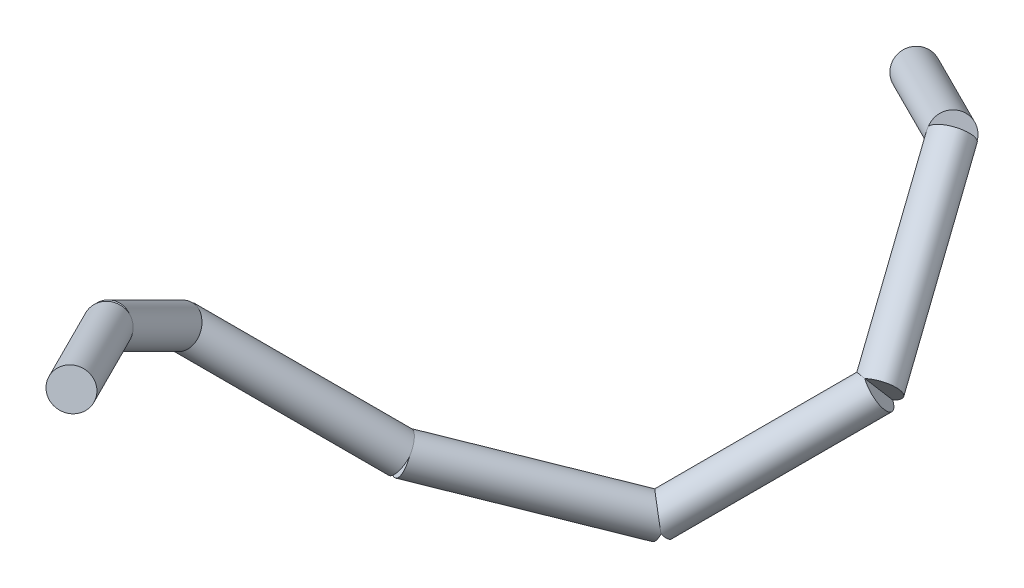
ISO-10303-21;
HEADER;
FILE_DESCRIPTION(('STEP AP214'),'2;1');
FILE_NAME('part.step','',(''),(''),'','','');
FILE_SCHEMA(('AUTOMOTIVE_DESIGN { 1 0 10303 214 1 1 1 1 }'));
ENDSEC;
DATA;
#1=APPLICATION_CONTEXT('core data for automotive mechanical design processes');
#2=APPLICATION_PROTOCOL_DEFINITION('international standard','automotive_design',2000,#1);
#3=PRODUCT_CONTEXT('',#1,'mechanical');
#4=PRODUCT('Part','Part','',(#3));
#5=PRODUCT_RELATED_PRODUCT_CATEGORY('part','',(#4));
#6=PRODUCT_DEFINITION_FORMATION('','',#4);
#7=PRODUCT_DEFINITION_CONTEXT('part definition',#1,'design');
#8=PRODUCT_DEFINITION('design','',#6,#7);
#9=PRODUCT_DEFINITION_SHAPE('','',#8);
#10=(LENGTH_UNIT() NAMED_UNIT(*) SI_UNIT(.MILLI.,.METRE.));
#11=(NAMED_UNIT(*) PLANE_ANGLE_UNIT() SI_UNIT($,.RADIAN.));
#12=(NAMED_UNIT(*) SI_UNIT($,.STERADIAN.) SOLID_ANGLE_UNIT());
#13=UNCERTAINTY_MEASURE_WITH_UNIT(LENGTH_MEASURE(1.E-05),#10,'distance_accuracy_value','');
#14=(GEOMETRIC_REPRESENTATION_CONTEXT(3) GLOBAL_UNCERTAINTY_ASSIGNED_CONTEXT((#13)) GLOBAL_UNIT_ASSIGNED_CONTEXT((#10,
#11,#12)) REPRESENTATION_CONTEXT('',''));
#15=CARTESIAN_POINT('',(0.,0.,0.));
#16=DIRECTION('',(0.,0.,1.));
#17=DIRECTION('',(1.,0.,0.));
#18=AXIS2_PLACEMENT_3D('',#15,#16,#17);
#19=CARTESIAN_POINT('',(0.,0.,0.));
#20=DIRECTION('',(0.742781352708207,0.371390676354103,0.557086014531156));
#21=DIRECTION('',(0.,-0.832050294337844,0.554700196225229));
#22=AXIS2_PLACEMENT_3D('',#19,#20,#21);
#23=PLANE('',#22);
#24=CARTESIAN_POINT('',(0.,0.,0.));
#25=DIRECTION('',(0.742781352708208,0.371390676354104,0.557086014531156));
#26=DIRECTION('',(0.645668811625015,-0.177165594188004,-0.742781352708018));
#27=AXIS2_PLACEMENT_3D('',#24,#25,#26);
#28=CIRCLE('',#27,10.);
#29=CARTESIAN_POINT('',(6.456688116249,-1.771655941875,-7.427813527082));
#30=VERTEX_POINT('',#29);
#31=EDGE_CURVE('E11',#30,#30,#28,.T.);
#32=ORIENTED_EDGE('',*,*,#31,.F.);
#33=EDGE_LOOP('',(#32));
#34=FACE_BOUND('',#33,.T.);
#35=ADVANCED_FACE('F17',(#34),#23,.F.);
#36=CARTESIAN_POINT('',(80.,40.,60.));
#37=DIRECTION('',(0.742781352708207,0.371390676354103,0.557086014531156));
#38=DIRECTION('',(0.,-0.832050294337844,0.554700196225229));
#39=AXIS2_PLACEMENT_3D('',#36,#37,#38);
#40=PLANE('',#39);
#41=CARTESIAN_POINT('',(80.,40.,60.));
#42=DIRECTION('',(0.742781352708208,0.371390676354104,0.557086014531156));
#43=DIRECTION('',(0.645668811625015,-0.177165594188004,-0.742781352708018));
#44=AXIS2_PLACEMENT_3D('',#41,#42,#43);
#45=CIRCLE('',#44,10.);
#46=CARTESIAN_POINT('',(86.693743463144,36.062503845209,53.700006152335));
#47=VERTEX_POINT('',#46);
#48=CARTESIAN_POINT('',(86.456688116249,38.228344058125,52.572186472918));
#49=VERTEX_POINT('',#48);
#50=EDGE_CURVE('E306',#47,#49,#45,.T.);
#51=ORIENTED_EDGE('',*,*,#50,.T.);
#52=CARTESIAN_POINT('',(80.,40.,60.));
#53=DIRECTION('',(0.742781352708208,0.371390676354104,0.557086014531156));
#54=DIRECTION('',(0.645668811625015,-0.177165594188004,-0.742781352708018));
#55=AXIS2_PLACEMENT_3D('',#52,#53,#54);
#56=CIRCLE('',#55,10.);
#57=CARTESIAN_POINT('',(73.306256536856,43.937496154791,66.299993847665));
#58=VERTEX_POINT('',#57);
#59=EDGE_CURVE('E26',#49,#58,#56,.T.);
#60=ORIENTED_EDGE('',*,*,#59,.T.);
#61=DIRECTION('',(0.669374346314016,-0.393749615479009,-0.629999384767015));
#62=VECTOR('',#61,1.);
#63=CARTESIAN_POINT('',(80.,40.,60.));
#64=LINE('',#63,#62);
#65=EDGE_CURVE('E299',#58,#47,#64,.T.);
#66=ORIENTED_EDGE('',*,*,#65,.T.);
#67=EDGE_LOOP('',(#51,#60,#66));
#68=FACE_BOUND('',#67,.T.);
#69=ADVANCED_FACE('F19',(#68),#40,.T.);
#70=CARTESIAN_POINT('',(0.,0.,0.));
#71=DIRECTION('',(0.742781352708208,0.371390676354104,0.557086014531156));
#72=DIRECTION('',(0.645668811625015,-0.177165594188004,-0.742781352708018));
#73=AXIS2_PLACEMENT_3D('',#70,#71,#72);
#74=CYLINDRICAL_SURFACE('',#73,10.);
#75=DIRECTION('',(0.742781352708207,0.371390676354103,0.557086014531156));
#76=VECTOR('',#75,1.);
#77=CARTESIAN_POINT('',(6.456688116249,-1.771655941875,-7.427813527082));
#78=LINE('',#77,#76);
#79=EDGE_CURVE('E303',#30,#49,#78,.T.);
#80=ORIENTED_EDGE('',*,*,#79,.T.);
#81=ORIENTED_EDGE('',*,*,#50,.F.);
#82=CARTESIAN_POINT('',(80.,40.,60.));
#83=DIRECTION('',(0.64699663922071,-0.107832773203485,0.754829412423995));
#84=DIRECTION('',(0.365148371670111,0.912870929175277,-0.182574185835055));
#85=AXIS2_PLACEMENT_3D('',#82,#83,#84);
#86=ELLIPSE('',#85,11.613945106217,10.);
#87=EDGE_CURVE('E203',#58,#47,#86,.T.);
#88=ORIENTED_EDGE('',*,*,#87,.F.);
#89=ORIENTED_EDGE('',*,*,#59,.F.);
#90=ORIENTED_EDGE('',*,*,#79,.F.);
#91=ORIENTED_EDGE('',*,*,#31,.T.);
#92=EDGE_LOOP('',(#80,#81,#88,#89,#90,#91));
#93=FACE_BOUND('',#92,.T.);
#94=ADVANCED_FACE('F317',(#93),#74,.T.);
#95=CARTESIAN_POINT('',(80.,40.,60.));
#96=DIRECTION('',(0.371390676354103,-0.557086014531156,0.742781352708207));
#97=DIRECTION('',(-0.832050294337844,-0.554700196225229,0.));
#98=AXIS2_PLACEMENT_3D('',#95,#96,#97);
#99=PLANE('',#98);
#100=ORIENTED_EDGE('',*,*,#65,.F.);
#101=CARTESIAN_POINT('',(80.,40.,60.));
#102=DIRECTION('',(0.371390676354104,-0.557086014531156,0.742781352708208));
#103=DIRECTION('',(0.920855800833292,0.118716298750038,-0.371390676354117));
#104=AXIS2_PLACEMENT_3D('',#101,#102,#103);
#105=CIRCLE('',#104,10.);
#106=CARTESIAN_POINT('',(89.208558008333,41.187162987501,56.286093236459));
#107=VERTEX_POINT('',#106);
#108=EDGE_CURVE('E199',#107,#58,#105,.T.);
#109=ORIENTED_EDGE('',*,*,#108,.F.);
#110=CARTESIAN_POINT('',(80.,40.,60.));
#111=DIRECTION('',(0.371390676354104,-0.557086014531156,0.742781352708208));
#112=DIRECTION('',(0.920855800833292,0.118716298750038,-0.371390676354117));
#113=AXIS2_PLACEMENT_3D('',#110,#111,#112);
#114=CIRCLE('',#113,10.);
#115=EDGE_CURVE('E296',#47,#107,#114,.T.);
#116=ORIENTED_EDGE('',*,*,#115,.F.);
#117=EDGE_LOOP('',(#100,#109,#116));
#118=FACE_BOUND('',#117,.T.);
#119=ADVANCED_FACE('F315',(#118),#99,.F.);
#120=CARTESIAN_POINT('',(120.,-20.,140.));
#121=DIRECTION('',(0.371390676354103,-0.557086014531156,0.742781352708207));
#122=DIRECTION('',(-0.832050294337844,-0.554700196225229,0.));
#123=AXIS2_PLACEMENT_3D('',#120,#121,#122);
#124=PLANE('',#123);
#125=CARTESIAN_POINT('',(120.,-20.,140.));
#126=DIRECTION('',(0.371390676354104,-0.557086014531156,0.742781352708208));
#127=DIRECTION('',(0.920855800833292,0.118716298750038,-0.371390676354117));
#128=AXIS2_PLACEMENT_3D('',#125,#126,#127);
#129=CIRCLE('',#128,10.);
#130=CARTESIAN_POINT('',(121.27000127,-27.62000762001,133.64999364999));
#131=VERTEX_POINT('',#130);
#132=CARTESIAN_POINT('',(129.20855800833,-18.81283701249,136.28609323645));
#133=VERTEX_POINT('',#132);
#134=EDGE_CURVE('E178',#131,#133,#129,.T.);
#135=ORIENTED_EDGE('',*,*,#134,.T.);
#136=CARTESIAN_POINT('',(120.,-20.,140.));
#137=DIRECTION('',(0.371390676354104,-0.557086014531156,0.742781352708208));
#138=DIRECTION('',(0.920855800833292,0.118716298750038,-0.371390676354117));
#139=AXIS2_PLACEMENT_3D('',#136,#137,#138);
#140=CIRCLE('',#139,10.);
#141=CARTESIAN_POINT('',(118.72999872999,-12.37999237998,146.35000635001));
#142=VERTEX_POINT('',#141);
#143=EDGE_CURVE('E272',#133,#142,#140,.T.);
#144=ORIENTED_EDGE('',*,*,#143,.T.);
#145=DIRECTION('',(0.127000127000013,-0.762000762001079,-0.635000635001065));
#146=VECTOR('',#145,1.);
#147=CARTESIAN_POINT('',(120.,-20.,140.));
#148=LINE('',#147,#146);
#149=EDGE_CURVE('E287',#142,#131,#148,.T.);
#150=ORIENTED_EDGE('',*,*,#149,.T.);
#151=EDGE_LOOP('',(#135,#144,#150));
#152=FACE_BOUND('',#151,.T.);
#153=ADVANCED_FACE('F325',(#152),#124,.T.);
#154=CARTESIAN_POINT('',(80.,40.,60.));
#155=DIRECTION('',(0.371390676354104,-0.557086014531156,0.742781352708208));
#156=DIRECTION('',(0.920855800833292,0.118716298750038,-0.371390676354117));
#157=AXIS2_PLACEMENT_3D('',#154,#155,#156);
#158=CYLINDRICAL_SURFACE('',#157,10.);
#159=ORIENTED_EDGE('',*,*,#143,.F.);
#160=DIRECTION('',(0.371390676354103,-0.557086014531156,0.742781352708207));
#161=VECTOR('',#160,1.);
#162=CARTESIAN_POINT('',(89.208558008333,41.187162987501,56.286093236459));
#163=LINE('',#162,#161);
#164=EDGE_CURVE('E204',#107,#133,#163,.T.);
#165=ORIENTED_EDGE('',*,*,#164,.F.);
#166=ORIENTED_EDGE('',*,*,#108,.T.);
#167=ORIENTED_EDGE('',*,*,#87,.T.);
#168=ORIENTED_EDGE('',*,*,#115,.T.);
#169=ORIENTED_EDGE('',*,*,#164,.T.);
#170=ORIENTED_EDGE('',*,*,#134,.F.);
#171=CARTESIAN_POINT('',(120.,-20.,140.));
#172=DIRECTION('',(-0.117506925789919,-0.647234335479943,0.753179817418948));
#173=DIRECTION('',(0.984917808821325,0.021036959972447,0.171739209797057));
#174=AXIS2_PLACEMENT_3D('',#171,#172,#173);
#175=ELLIPSE('',#174,11.410677616157,10.);
#176=EDGE_CURVE('E214',#142,#131,#175,.T.);
#177=ORIENTED_EDGE('',*,*,#176,.F.);
#178=EDGE_LOOP('',(#159,#165,#166,#167,#168,#169,#170,#177));
#179=FACE_BOUND('',#178,.T.);
#180=ADVANCED_FACE('F320',(#179),#158,.T.);
#181=CARTESIAN_POINT('',(120.,-20.,140.));
#182=DIRECTION('',(-0.577350269189626,-0.577350269189626,0.577350269189626));
#183=DIRECTION('',(-0.707106781186548,0.707106781186548,0.));
#184=AXIS2_PLACEMENT_3D('',#181,#182,#183);
#185=PLANE('',#184);
#186=ORIENTED_EDGE('',*,*,#149,.F.);
#187=CARTESIAN_POINT('',(120.,-20.,140.));
#188=DIRECTION('',(-0.577350269189626,-0.577350269189626,0.577350269189626));
#189=DIRECTION('',(0.788675134594744,-0.211324865404932,0.577350269189813));
#190=AXIS2_PLACEMENT_3D('',#187,#188,#189);
#191=CIRCLE('',#190,10.);
#192=CARTESIAN_POINT('',(127.88675134594,-22.11324865405,145.77350269189));
#193=VERTEX_POINT('',#192);
#194=EDGE_CURVE('E219',#193,#142,#191,.T.);
#195=ORIENTED_EDGE('',*,*,#194,.F.);
#196=CARTESIAN_POINT('',(120.,-20.,140.));
#197=DIRECTION('',(-0.577350269189626,-0.577350269189626,0.577350269189626));
#198=DIRECTION('',(0.788675134594744,-0.211324865404932,0.577350269189813));
#199=AXIS2_PLACEMENT_3D('',#196,#197,#198);
#200=CIRCLE('',#199,10.);
#201=EDGE_CURVE('E218',#131,#193,#200,.T.);
#202=ORIENTED_EDGE('',*,*,#201,.F.);
#203=EDGE_LOOP('',(#186,#195,#202));
#204=FACE_BOUND('',#203,.T.);
#205=ADVANCED_FACE('F328',(#204),#185,.F.);
#206=CARTESIAN_POINT('',(60.,-80.,200.));
#207=DIRECTION('',(-0.577350269189626,-0.577350269189626,0.577350269189626));
#208=DIRECTION('',(-0.707106781186548,0.707106781186548,0.));
#209=AXIS2_PLACEMENT_3D('',#206,#207,#208);
#210=PLANE('',#209);
#211=CARTESIAN_POINT('',(60.,-80.,200.));
#212=DIRECTION('',(-0.577350269189626,-0.577350269189626,0.577350269189626));
#213=DIRECTION('',(0.788675134594744,-0.211324865404932,0.577350269189813));
#214=AXIS2_PLACEMENT_3D('',#211,#212,#213);
#215=CIRCLE('',#214,10.);
#216=CARTESIAN_POINT('',(52.379992379989,-78.72999872999,193.64999364999));
#217=VERTEX_POINT('',#216);
#218=CARTESIAN_POINT('',(67.886751345948,-82.11324865405,205.77350269189));
#219=VERTEX_POINT('',#218);
#220=EDGE_CURVE('E281',#217,#219,#215,.T.);
#221=ORIENTED_EDGE('',*,*,#220,.T.);
#222=CARTESIAN_POINT('',(60.,-80.,200.));
#223=DIRECTION('',(-0.577350269189626,-0.577350269189626,0.577350269189626));
#224=DIRECTION('',(0.788675134594744,-0.211324865404932,0.577350269189813));
#225=AXIS2_PLACEMENT_3D('',#222,#223,#224);
#226=CIRCLE('',#225,10.);
#227=CARTESIAN_POINT('',(67.620007620011,-81.27000127,206.35000635001));
#228=VERTEX_POINT('',#227);
#229=EDGE_CURVE('E237',#219,#228,#226,.T.);
#230=ORIENTED_EDGE('',*,*,#229,.T.);
#231=DIRECTION('',(-0.762000762001079,0.127000127000013,-0.635000635001065));
#232=VECTOR('',#231,1.);
#233=CARTESIAN_POINT('',(60.,-80.,200.));
#234=LINE('',#233,#232);
#235=EDGE_CURVE('E284',#228,#217,#234,.T.);
#236=ORIENTED_EDGE('',*,*,#235,.T.);
#237=EDGE_LOOP('',(#221,#230,#236));
#238=FACE_BOUND('',#237,.T.);
#239=ADVANCED_FACE('F393',(#238),#210,.T.);
#240=CARTESIAN_POINT('',(60.,-80.,200.));
#241=DIRECTION('',(-0.557086014531156,0.371390676354103,0.742781352708207));
#242=DIRECTION('',(0.554700196225229,0.832050294337844,0.));
#243=AXIS2_PLACEMENT_3D('',#240,#241,#242);
#244=PLANE('',#243);
#245=CARTESIAN_POINT('',(60.,-80.,200.));
#246=DIRECTION('',(-0.557086014531003,0.371390676354126,0.742781352708311));
#247=DIRECTION('',(0.821925551875018,0.118716298750003,0.557086014531012));
#248=AXIS2_PLACEMENT_3D('',#245,#246,#247);
#249=CIRCLE('',#248,10.);
#250=EDGE_CURVE('E211',#217,#228,#249,.T.);
#251=ORIENTED_EDGE('',*,*,#250,.F.);
#252=ORIENTED_EDGE('',*,*,#235,.F.);
#253=EDGE_LOOP('',(#251,#252));
#254=FACE_BOUND('',#253,.T.);
#255=ADVANCED_FACE('F339',(#254),#244,.F.);
#256=CARTESIAN_POINT('',(120.,-20.,140.));
#257=DIRECTION('',(-0.577350269189626,-0.577350269189626,0.577350269189626));
#258=DIRECTION('',(0.788675134594745,-0.211324865404932,0.577350269189813));
#259=AXIS2_PLACEMENT_3D('',#256,#257,#258);
#260=CYLINDRICAL_SURFACE('',#259,10.);
#261=ORIENTED_EDGE('',*,*,#229,.F.);
#262=DIRECTION('',(-0.577350269189626,-0.577350269189626,0.577350269189626));
#263=VECTOR('',#262,1.);
#264=CARTESIAN_POINT('',(127.88675134594,-22.11324865405,145.77350269189));
#265=LINE('',#264,#263);
#266=EDGE_CURVE('E233',#193,#219,#265,.T.);
#267=ORIENTED_EDGE('',*,*,#266,.F.);
#268=ORIENTED_EDGE('',*,*,#194,.T.);
#269=ORIENTED_EDGE('',*,*,#176,.T.);
#270=ORIENTED_EDGE('',*,*,#201,.T.);
#271=ORIENTED_EDGE('',*,*,#266,.T.);
#272=ORIENTED_EDGE('',*,*,#220,.F.);
#273=CARTESIAN_POINT('',(60.,-80.,200.));
#274=DIRECTION('',(-0.647234335479943,-0.117506925789919,0.753179817418948));
#275=DIRECTION('',(-0.021036959972447,-0.984917808821325,-0.171739209797057));
#276=AXIS2_PLACEMENT_3D('',#273,#274,#275);
#277=ELLIPSE('',#276,11.410677616157,10.);
#278=CARTESIAN_POINT('',(67.416130603844,-78.27742040256,206.64169336518));
#279=VERTEX_POINT('',#278);
#280=EDGE_CURVE('E208',#279,#217,#277,.T.);
#281=ORIENTED_EDGE('',*,*,#280,.F.);
#282=CARTESIAN_POINT('',(60.,-80.,200.));
#283=DIRECTION('',(-0.647234335479943,-0.117506925789919,0.753179817418948));
#284=DIRECTION('',(-0.021036959972447,-0.984917808821325,-0.171739209797057));
#285=AXIS2_PLACEMENT_3D('',#282,#283,#284);
#286=ELLIPSE('',#285,11.410677616157,10.);
#287=EDGE_CURVE('E252',#228,#279,#286,.T.);
#288=ORIENTED_EDGE('',*,*,#287,.F.);
#289=EDGE_LOOP('',(#261,#267,#268,#269,#270,#271,#272,#281,#288));
#290=FACE_BOUND('',#289,.T.);
#291=ADVANCED_FACE('F332',(#290),#260,.T.);
#292=CARTESIAN_POINT('',(0.,-40.,280.));
#293=DIRECTION('',(-0.557086014531156,0.371390676354103,0.742781352708207));
#294=DIRECTION('',(0.554700196225229,0.832050294337844,0.));
#295=AXIS2_PLACEMENT_3D('',#292,#293,#294);
#296=PLANE('',#295);
#297=CARTESIAN_POINT('',(0.,-40.,280.));
#298=DIRECTION('',(-0.557086014531003,0.371390676354126,0.742781352708311));
#299=DIRECTION('',(0.821925551875018,0.118716298750003,0.557086014531012));
#300=AXIS2_PLACEMENT_3D('',#297,#298,#299);
#301=CIRCLE('',#300,10.);
#302=CARTESIAN_POINT('',(-8.164965809277,-44.08248290463,275.91751709536));
#303=VERTEX_POINT('',#302);
#304=CARTESIAN_POINT('',(8.219255518749,-38.81283701249,285.57086014531));
#305=VERTEX_POINT('',#304);
#306=EDGE_CURVE('E260',#303,#305,#301,.T.);
#307=ORIENTED_EDGE('',*,*,#306,.T.);
#308=CARTESIAN_POINT('',(0.,-40.,280.));
#309=DIRECTION('',(-0.557086014531003,0.371390676354126,0.742781352708311));
#310=DIRECTION('',(0.821925551875018,0.118716298750003,0.557086014531012));
#311=AXIS2_PLACEMENT_3D('',#308,#309,#310);
#312=CIRCLE('',#311,10.);
#313=CARTESIAN_POINT('',(8.164965809277,-35.91751709536,284.08248290463));
#314=VERTEX_POINT('',#313);
#315=EDGE_CURVE('E212',#305,#314,#312,.T.);
#316=ORIENTED_EDGE('',*,*,#315,.T.);
#317=DIRECTION('',(-0.816496580927726,-0.408248290463863,-0.408248290463863));
#318=VECTOR('',#317,1.);
#319=CARTESIAN_POINT('',(0.,-40.,280.));
#320=LINE('',#319,#318);
#321=EDGE_CURVE('E248',#314,#303,#320,.T.);
#322=ORIENTED_EDGE('',*,*,#321,.T.);
#323=EDGE_LOOP('',(#307,#316,#322));
#324=FACE_BOUND('',#323,.T.);
#325=ADVANCED_FACE('F345',(#324),#296,.T.);
#326=CARTESIAN_POINT('',(-60.,20.,340.));
#327=DIRECTION('',(-0.577350269189626,0.577350269189626,0.577350269189626));
#328=DIRECTION('',(0.707106781186548,0.,0.707106781186548));
#329=AXIS2_PLACEMENT_3D('',#326,#327,#328);
#330=PLANE('',#329);
#331=DIRECTION('',(0.196116135137915,0.784464540552659,-0.588348405414744));
#332=VECTOR('',#331,1.);
#333=CARTESIAN_POINT('',(-60.,20.,340.));
#334=LINE('',#333,#332);
#335=CARTESIAN_POINT('',(-61.96116135138,12.155354594473,345.88348405414));
#336=VERTEX_POINT('',#335);
#337=CARTESIAN_POINT('',(-58.03883864861,27.844645405527,334.11651594585));
#338=VERTEX_POINT('',#337);
#339=EDGE_CURVE('E245',#336,#338,#334,.T.);
#340=ORIENTED_EDGE('',*,*,#339,.T.);
#341=CARTESIAN_POINT('',(-60.,20.,340.));
#342=DIRECTION('',(-0.577350269189626,0.577350269189626,0.577350269189626));
#343=DIRECTION('',(0.788675134594744,0.211324865404932,0.577350269189813));
#344=AXIS2_PLACEMENT_3D('',#341,#342,#343);
#345=CIRCLE('',#344,10.);
#346=EDGE_CURVE('E187',#338,#336,#345,.T.);
#347=ORIENTED_EDGE('',*,*,#346,.T.);
#348=EDGE_LOOP('',(#340,#347));
#349=FACE_BOUND('',#348,.T.);
#350=ADVANCED_FACE('F364',(#349),#330,.T.);
#351=CARTESIAN_POINT('',(60.,-80.,200.));
#352=DIRECTION('',(-0.557086014531003,0.371390676354126,0.742781352708311));
#353=DIRECTION('',(0.821925551875018,0.118716298750003,0.557086014531012));
#354=AXIS2_PLACEMENT_3D('',#351,#352,#353);
#355=CYLINDRICAL_SURFACE('',#354,10.);
#356=ORIENTED_EDGE('',*,*,#287,.T.);
#357=DIRECTION('',(-0.557086014531156,0.371390676354103,0.742781352708207));
#358=VECTOR('',#357,1.);
#359=CARTESIAN_POINT('',(68.219255518749,-78.81283701249,205.57086014531));
#360=LINE('',#359,#358);
#361=EDGE_CURVE('E256',#279,#305,#360,.T.);
#362=ORIENTED_EDGE('',*,*,#361,.T.);
#363=ORIENTED_EDGE('',*,*,#306,.F.);
#364=CARTESIAN_POINT('',(0.,-40.,280.));
#365=DIRECTION('',(-0.572261781785836,0.478588521665261,0.66593504190541));
#366=DIRECTION('',(0.076483896612248,-0.777358578947675,0.624390785722739));
#367=AXIS2_PLACEMENT_3D('',#364,#365,#366);
#368=ELLIPSE('',#367,10.088918875348,10.);
#369=EDGE_CURVE('E241',#314,#303,#368,.T.);
#370=ORIENTED_EDGE('',*,*,#369,.F.);
#371=ORIENTED_EDGE('',*,*,#315,.F.);
#372=ORIENTED_EDGE('',*,*,#361,.F.);
#373=ORIENTED_EDGE('',*,*,#280,.T.);
#374=ORIENTED_EDGE('',*,*,#250,.T.);
#375=EDGE_LOOP('',(#356,#362,#363,#370,#371,#372,#373,#374));
#376=FACE_BOUND('',#375,.T.);
#377=ADVANCED_FACE('F341',(#376),#355,.T.);
#378=CARTESIAN_POINT('',(0.,-40.,280.));
#379=DIRECTION('',(-0.577350269189626,0.577350269189626,0.577350269189626));
#380=DIRECTION('',(0.707106781186548,0.,0.707106781186548));
#381=AXIS2_PLACEMENT_3D('',#378,#379,#380);
#382=PLANE('',#381);
#383=ORIENTED_EDGE('',*,*,#321,.F.);
#384=CARTESIAN_POINT('',(0.,-40.,280.));
#385=DIRECTION('',(-0.577350269189626,0.577350269189626,0.577350269189626));
#386=DIRECTION('',(0.788675134594744,0.211324865404932,0.577350269189813));
#387=AXIS2_PLACEMENT_3D('',#384,#385,#386);
#388=CIRCLE('',#387,10.);
#389=CARTESIAN_POINT('',(7.886751345948,-37.88675134594,285.77350269189));
#390=VERTEX_POINT('',#389);
#391=EDGE_CURVE('E191',#390,#314,#388,.T.);
#392=ORIENTED_EDGE('',*,*,#391,.F.);
#393=CARTESIAN_POINT('',(0.,-40.,280.));
#394=DIRECTION('',(-0.577350269189626,0.577350269189626,0.577350269189626));
#395=DIRECTION('',(0.788675134594744,0.211324865404932,0.577350269189813));
#396=AXIS2_PLACEMENT_3D('',#393,#394,#395);
#397=CIRCLE('',#396,10.);
#398=EDGE_CURVE('E180',#303,#390,#397,.T.);
#399=ORIENTED_EDGE('',*,*,#398,.F.);
#400=EDGE_LOOP('',(#383,#392,#399));
#401=FACE_BOUND('',#400,.T.);
#402=ADVANCED_FACE('F351',(#401),#382,.F.);
#403=CARTESIAN_POINT('',(-40.,60.,400.));
#404=DIRECTION('',(0.267261241912067,0.534522483825135,0.801783725737202));
#405=DIRECTION('',(0.894427191000251,-0.447213595499289,0.));
#406=AXIS2_PLACEMENT_3D('',#403,#404,#405);
#407=PLANE('',#406);
#408=DIRECTION('',(0.577350269189626,0.577350269189626,-0.577350269189626));
#409=VECTOR('',#408,1.);
#410=CARTESIAN_POINT('',(-40.,60.,400.));
#411=LINE('',#410,#409);
#412=CARTESIAN_POINT('',(-45.77350269189,54.226497308103,405.77350269189));
#413=VERTEX_POINT('',#412);
#414=CARTESIAN_POINT('',(-34.2264973081,65.773502691896,394.2264973081));
#415=VERTEX_POINT('',#414);
#416=EDGE_CURVE('E183',#413,#415,#411,.T.);
#417=ORIENTED_EDGE('',*,*,#416,.T.);
#418=CARTESIAN_POINT('',(-40.,60.,400.));
#419=DIRECTION('',(0.267261241912189,0.534522483825124,0.801783725737168));
#420=DIRECTION('',(0.960356745147528,-0.0792865097051336,-0.267261241912147));
#421=AXIS2_PLACEMENT_3D('',#418,#419,#420);
#422=CIRCLE('',#421,10.);
#423=EDGE_CURVE('E163',#415,#413,#422,.T.);
#424=ORIENTED_EDGE('',*,*,#423,.T.);
#425=EDGE_LOOP('',(#417,#424));
#426=FACE_BOUND('',#425,.T.);
#427=ADVANCED_FACE('F368',(#426),#407,.T.);
#428=CARTESIAN_POINT('',(-60.,20.,340.));
#429=DIRECTION('',(0.267261241912067,0.534522483825135,0.801783725737202));
#430=DIRECTION('',(0.894427191000251,-0.447213595499289,0.));
#431=AXIS2_PLACEMENT_3D('',#428,#429,#430);
#432=PLANE('',#431);
#433=CARTESIAN_POINT('',(-60.,20.,340.));
#434=DIRECTION('',(0.267261241912189,0.534522483825124,0.801783725737168));
#435=DIRECTION('',(0.960356745147528,-0.0792865097051336,-0.267261241912147));
#436=AXIS2_PLACEMENT_3D('',#433,#434,#435);
#437=CIRCLE('',#436,10.);
#438=EDGE_CURVE('E198',#338,#336,#437,.T.);
#439=ORIENTED_EDGE('',*,*,#438,.F.);
#440=ORIENTED_EDGE('',*,*,#339,.F.);
#441=EDGE_LOOP('',(#439,#440));
#442=FACE_BOUND('',#441,.T.);
#443=ADVANCED_FACE('F362',(#442),#432,.F.);
#444=CARTESIAN_POINT('',(0.,-40.,280.));
#445=DIRECTION('',(-0.577350269189626,0.577350269189626,0.577350269189626));
#446=DIRECTION('',(0.788675134594745,0.211324865404932,0.577350269189813));
#447=AXIS2_PLACEMENT_3D('',#444,#445,#446);
#448=CYLINDRICAL_SURFACE('',#447,10.);
#449=ORIENTED_EDGE('',*,*,#398,.T.);
#450=DIRECTION('',(-0.577350269189626,0.577350269189626,0.577350269189626));
#451=VECTOR('',#450,1.);
#452=CARTESIAN_POINT('',(7.886751345948,-37.88675134594,285.77350269189));
#453=LINE('',#452,#451);
#454=CARTESIAN_POINT('',(-49.30488256841,19.304882568417,342.96513660626));
#455=VERTEX_POINT('',#454);
#456=EDGE_CURVE('E182',#390,#455,#453,.T.);
#457=ORIENTED_EDGE('',*,*,#456,.T.);
#458=CARTESIAN_POINT('',(-60.,20.,340.));
#459=DIRECTION('',(-0.17242003752903,0.618239037626742,0.766845370992646));
#460=DIRECTION('',(-0.965302953583484,0.0489476962658645,-0.256504056173128));
#461=AXIS2_PLACEMENT_3D('',#458,#459,#460);
#462=ELLIPSE('',#461,11.120679699194,10.);
#463=EDGE_CURVE('E194',#336,#455,#462,.T.);
#464=ORIENTED_EDGE('',*,*,#463,.F.);
#465=ORIENTED_EDGE('',*,*,#346,.F.);
#466=CARTESIAN_POINT('',(-60.,20.,340.));
#467=DIRECTION('',(-0.17242003752903,0.618239037626742,0.766845370992646));
#468=DIRECTION('',(-0.965302953583484,0.0489476962658645,-0.256504056173128));
#469=AXIS2_PLACEMENT_3D('',#466,#467,#468);
#470=ELLIPSE('',#469,11.120679699194,10.);
#471=CARTESIAN_POINT('',(-49.14947440465,21.701051190687,341.06826201248));
#472=VERTEX_POINT('',#471);
#473=EDGE_CURVE('E223',#472,#338,#470,.T.);
#474=ORIENTED_EDGE('',*,*,#473,.F.);
#475=CARTESIAN_POINT('',(-60.,20.,340.));
#476=DIRECTION('',(-0.17242003752903,0.618239037626742,0.766845370992646));
#477=DIRECTION('',(-0.965302953583484,0.0489476962658645,-0.256504056173128));
#478=AXIS2_PLACEMENT_3D('',#475,#476,#477);
#479=ELLIPSE('',#478,11.120679699194,10.);
#480=EDGE_CURVE('E155',#455,#472,#479,.T.);
#481=ORIENTED_EDGE('',*,*,#480,.F.);
#482=ORIENTED_EDGE('',*,*,#456,.F.);
#483=ORIENTED_EDGE('',*,*,#391,.T.);
#484=ORIENTED_EDGE('',*,*,#369,.T.);
#485=EDGE_LOOP('',(#449,#457,#464,#465,#474,#481,#482,#483,#484));
#486=FACE_BOUND('',#485,.T.);
#487=ADVANCED_FACE('F349',(#486),#448,.T.);
#488=CARTESIAN_POINT('',(0.,80.,460.));
#489=DIRECTION('',(0.534522483825135,0.267261241912067,0.801783725737202));
#490=DIRECTION('',(0.447213595499289,-0.894427191000251,0.));
#491=AXIS2_PLACEMENT_3D('',#488,#489,#490);
#492=PLANE('',#491);
#493=CARTESIAN_POINT('',(0.,80.,460.));
#494=DIRECTION('',(0.534522483824897,0.267261241912089,0.801783725737353));
#495=DIRECTION('',(0.841426980589804,-0.0792865097050715,-0.534522483824875));
#496=AXIS2_PLACEMENT_3D('',#493,#494,#495);
#497=CIRCLE('',#496,10.);
#498=CARTESIAN_POINT('',(8.414269805898,79.207134902949,454.65477516175));
#499=VERTEX_POINT('',#498);
#500=EDGE_CURVE('E167',#499,#499,#497,.T.);
#501=ORIENTED_EDGE('',*,*,#500,.T.);
#502=EDGE_LOOP('',(#501));
#503=FACE_BOUND('',#502,.T.);
#504=ADVANCED_FACE('F413',(#503),#492,.T.);
#505=CARTESIAN_POINT('',(-40.,60.,400.));
#506=DIRECTION('',(0.534522483825135,0.267261241912067,0.801783725737202));
#507=DIRECTION('',(0.447213595499289,-0.894427191000251,0.));
#508=AXIS2_PLACEMENT_3D('',#505,#506,#507);
#509=PLANE('',#508);
#510=CARTESIAN_POINT('',(-40.,60.,400.));
#511=DIRECTION('',(0.534522483824897,0.267261241912089,0.801783725737353));
#512=DIRECTION('',(0.841426980589804,-0.0792865097050715,-0.534522483824875));
#513=AXIS2_PLACEMENT_3D('',#510,#511,#512);
#514=CIRCLE('',#513,10.);
#515=EDGE_CURVE('E166',#415,#413,#514,.T.);
#516=ORIENTED_EDGE('',*,*,#515,.F.);
#517=ORIENTED_EDGE('',*,*,#416,.F.);
#518=EDGE_LOOP('',(#516,#517));
#519=FACE_BOUND('',#518,.T.);
#520=ADVANCED_FACE('F366',(#519),#509,.F.);
#521=CARTESIAN_POINT('',(-60.,20.,340.));
#522=DIRECTION('',(0.267261241912189,0.534522483825125,0.801783725737168));
#523=DIRECTION('',(0.960356745147528,-0.0792865097051336,-0.267261241912147));
#524=AXIS2_PLACEMENT_3D('',#521,#522,#523);
#525=CYLINDRICAL_SURFACE('',#524,10.);
#526=ORIENTED_EDGE('',*,*,#480,.T.);
#527=DIRECTION('',(0.267261241912067,0.534522483825135,0.801783725737202));
#528=VECTOR('',#527,1.);
#529=CARTESIAN_POINT('',(-50.39643254852,19.207134902949,337.32738758087));
#530=LINE('',#529,#528);
#531=CARTESIAN_POINT('',(-30.78148560587,58.437028788243,396.17222840881));
#532=VERTEX_POINT('',#531);
#533=EDGE_CURVE('E205',#472,#532,#530,.T.);
#534=ORIENTED_EDGE('',*,*,#533,.T.);
#535=CARTESIAN_POINT('',(-40.,60.,400.));
#536=DIRECTION('',(0.408248290463863,0.408248290463863,0.816496580927726));
#537=DIRECTION('',(-0.707106781186548,0.707106781186548,0.));
#538=AXIS2_PLACEMENT_3D('',#535,#536,#537);
#539=ELLIPSE('',#538,10.183501544346,10.);
#540=EDGE_CURVE('E151',#413,#532,#539,.T.);
#541=ORIENTED_EDGE('',*,*,#540,.F.);
#542=ORIENTED_EDGE('',*,*,#423,.F.);
#543=CARTESIAN_POINT('',(-40.,60.,400.));
#544=DIRECTION('',(0.408248290463863,0.408248290463863,0.816496580927726));
#545=DIRECTION('',(-0.707106781186548,0.707106781186548,0.));
#546=AXIS2_PLACEMENT_3D('',#543,#544,#545);
#547=ELLIPSE('',#546,10.183501544346,10.);
#548=CARTESIAN_POINT('',(-30.90372020129,59.548139899355,395.67779015096));
#549=VERTEX_POINT('',#548);
#550=EDGE_CURVE('E159',#549,#415,#547,.T.);
#551=ORIENTED_EDGE('',*,*,#550,.F.);
#552=CARTESIAN_POINT('',(-40.,60.,400.));
#553=DIRECTION('',(0.408248290463863,0.408248290463863,0.816496580927726));
#554=DIRECTION('',(-0.707106781186548,0.707106781186548,0.));
#555=AXIS2_PLACEMENT_3D('',#552,#553,#554);
#556=ELLIPSE('',#555,10.183501544346,10.);
#557=EDGE_CURVE('E143',#532,#549,#556,.T.);
#558=ORIENTED_EDGE('',*,*,#557,.F.);
#559=ORIENTED_EDGE('',*,*,#533,.F.);
#560=ORIENTED_EDGE('',*,*,#473,.T.);
#561=ORIENTED_EDGE('',*,*,#438,.T.);
#562=ORIENTED_EDGE('',*,*,#463,.T.);
#563=EDGE_LOOP('',(#526,#534,#541,#542,#551,#558,#559,#560,#561,#562));
#564=FACE_BOUND('',#563,.T.);
#565=ADVANCED_FACE('F161',(#564),#525,.T.);
#566=CARTESIAN_POINT('',(-40.,60.,400.));
#567=DIRECTION('',(0.534522483824897,0.267261241912089,0.801783725737353));
#568=DIRECTION('',(0.841426980589804,-0.0792865097050715,-0.534522483824875));
#569=AXIS2_PLACEMENT_3D('',#566,#567,#568);
#570=CYLINDRICAL_SURFACE('',#569,10.);
#571=DIRECTION('',(0.534522483825135,0.267261241912067,0.801783725737202));
#572=VECTOR('',#571,1.);
#573=CARTESIAN_POINT('',(-31.5857301941,59.207134902949,394.65477516175));
#574=LINE('',#573,#572);
#575=EDGE_CURVE('E148',#549,#499,#574,.T.);
#576=ORIENTED_EDGE('',*,*,#575,.T.);
#577=ORIENTED_EDGE('',*,*,#500,.F.);
#578=ORIENTED_EDGE('',*,*,#575,.F.);
#579=ORIENTED_EDGE('',*,*,#550,.T.);
#580=ORIENTED_EDGE('',*,*,#515,.T.);
#581=ORIENTED_EDGE('',*,*,#540,.T.);
#582=ORIENTED_EDGE('',*,*,#557,.T.);
#583=EDGE_LOOP('',(#576,#577,#578,#579,#580,#581,#582));
#584=FACE_BOUND('',#583,.T.);
#585=ADVANCED_FACE('F145',(#584),#570,.T.);
#586=CLOSED_SHELL('',(#35,#69,#94,#119,#153,#180,#205,#239,#255,#291,#325,#350,#377,#402,#427,
#443,#487,#504,#520,#565,#585));
#587=MANIFOLD_SOLID_BREP('B1',#586);
#588=ADVANCED_BREP_SHAPE_REPRESENTATION('',(#18,#587),#14);
#589=SHAPE_DEFINITION_REPRESENTATION(#9,#588);
ENDSEC;
END-ISO-10303-21;
